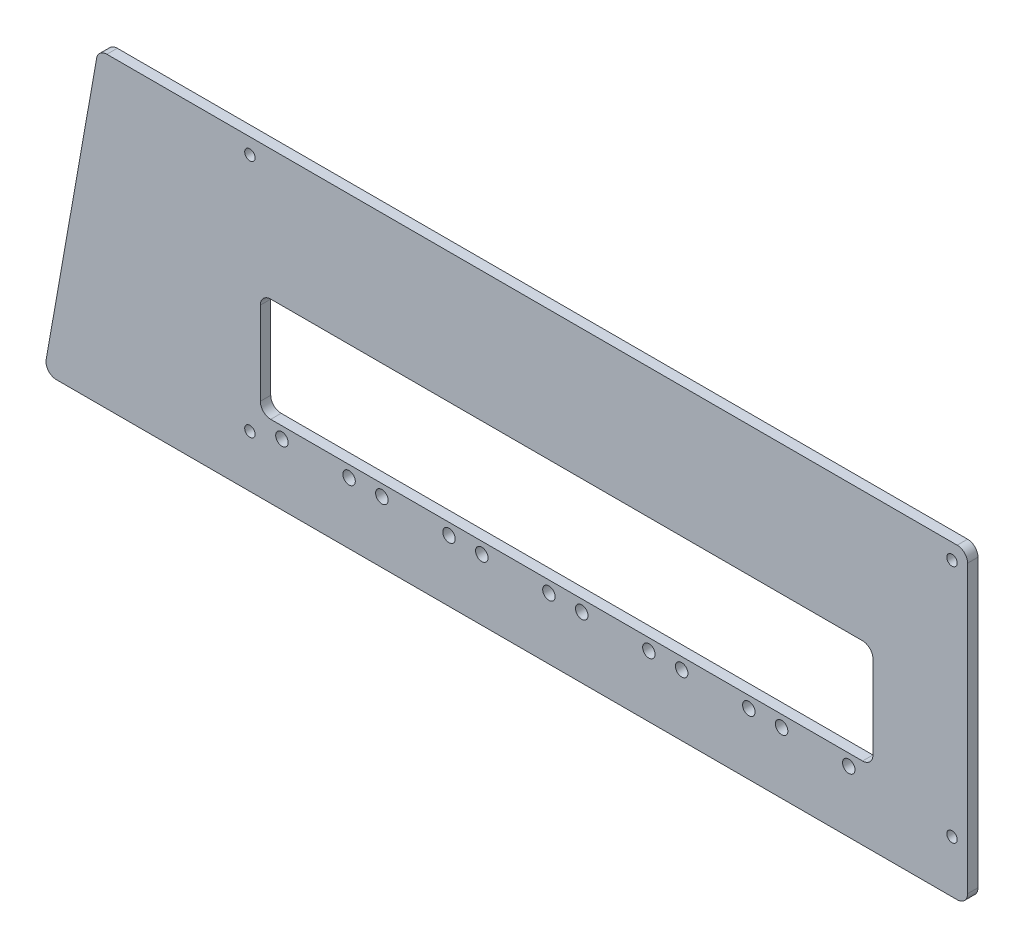
ISO-10303-21;
HEADER;
FILE_DESCRIPTION(('STEP AP214'),'2;1');
FILE_NAME('part.step','',(''),(''),'','','');
FILE_SCHEMA(('AUTOMOTIVE_DESIGN { 1 0 10303 214 1 1 1 1 }'));
ENDSEC;
DATA;
#1=APPLICATION_CONTEXT('core data for automotive mechanical design processes');
#2=APPLICATION_PROTOCOL_DEFINITION('international standard','automotive_design',2000,#1);
#3=PRODUCT_CONTEXT('',#1,'mechanical');
#4=PRODUCT('Part','Part','',(#3));
#5=PRODUCT_RELATED_PRODUCT_CATEGORY('part','',(#4));
#6=PRODUCT_DEFINITION_FORMATION('','',#4);
#7=PRODUCT_DEFINITION_CONTEXT('part definition',#1,'design');
#8=PRODUCT_DEFINITION('design','',#6,#7);
#9=PRODUCT_DEFINITION_SHAPE('','',#8);
#10=(LENGTH_UNIT() NAMED_UNIT(*) SI_UNIT(.MILLI.,.METRE.));
#11=(NAMED_UNIT(*) PLANE_ANGLE_UNIT() SI_UNIT($,.RADIAN.));
#12=(NAMED_UNIT(*) SI_UNIT($,.STERADIAN.) SOLID_ANGLE_UNIT());
#13=UNCERTAINTY_MEASURE_WITH_UNIT(LENGTH_MEASURE(1.E-05),#10,'distance_accuracy_value','');
#14=(GEOMETRIC_REPRESENTATION_CONTEXT(3) GLOBAL_UNCERTAINTY_ASSIGNED_CONTEXT((#13)) GLOBAL_UNIT_ASSIGNED_CONTEXT((#10,
#11,#12)) REPRESENTATION_CONTEXT('',''));
#15=CARTESIAN_POINT('',(0.,0.,0.));
#16=DIRECTION('',(0.,0.,1.));
#17=DIRECTION('',(1.,0.,0.));
#18=AXIS2_PLACEMENT_3D('',#15,#16,#17);
#19=CARTESIAN_POINT('',(127.96470119617,261.380138422726,10.));
#20=DIRECTION('',(0.,0.,-1.));
#21=DIRECTION('',(-1.,0.,0.));
#22=AXIS2_PLACEMENT_3D('',#19,#20,#21);
#23=PLANE('',#22);
#24=CARTESIAN_POINT('',(-40.6852988038306,35.3801384227226,10.));
#25=DIRECTION('',(0.,0.,1.));
#26=DIRECTION('',(1.,0.,0.));
#27=AXIS2_PLACEMENT_3D('',#24,#25,#26);
#28=CIRCLE('',#27,5.99999999999999);
#29=CARTESIAN_POINT('',(-34.6852988038307,35.3801384227226,10.));
#30=VERTEX_POINT('',#29);
#31=EDGE_CURVE('E398',#30,#30,#28,.T.);
#32=ORIENTED_EDGE('',*,*,#31,.F.);
#33=EDGE_LOOP('',(#32));
#34=FACE_BOUND('',#33,.T.);
#35=CARTESIAN_POINT('',(-136.685298803831,35.3801384227226,10.));
#36=DIRECTION('',(0.,0.,1.));
#37=DIRECTION('',(1.,0.,0.));
#38=AXIS2_PLACEMENT_3D('',#35,#36,#37);
#39=CIRCLE('',#38,5.99999999999999);
#40=CARTESIAN_POINT('',(-130.685298803831,35.3801384227226,10.));
#41=VERTEX_POINT('',#40);
#42=EDGE_CURVE('E408',#41,#41,#39,.T.);
#43=ORIENTED_EDGE('',*,*,#42,.F.);
#44=EDGE_LOOP('',(#43));
#45=FACE_BOUND('',#44,.T.);
#46=CARTESIAN_POINT('',(-520.68529880383,35.3801384227226,10.));
#47=DIRECTION('',(0.,0.,1.));
#48=DIRECTION('',(1.,0.,0.));
#49=AXIS2_PLACEMENT_3D('',#46,#47,#48);
#50=CIRCLE('',#49,5.99999999999999);
#51=CARTESIAN_POINT('',(-514.68529880383,35.3801384227226,10.));
#52=VERTEX_POINT('',#51);
#53=EDGE_CURVE('E418',#52,#52,#50,.T.);
#54=ORIENTED_EDGE('',*,*,#53,.F.);
#55=EDGE_LOOP('',(#54));
#56=FACE_BOUND('',#55,.T.);
#57=CARTESIAN_POINT('',(-168.18529880383,35.3801384227226,10.));
#58=DIRECTION('',(0.,0.,1.));
#59=DIRECTION('',(-1.,0.,0.));
#60=AXIS2_PLACEMENT_3D('',#57,#58,#59);
#61=CIRCLE('',#60,5.99999999999999);
#62=CARTESIAN_POINT('',(-174.18529880383,35.3801384227226,10.));
#63=VERTEX_POINT('',#62);
#64=EDGE_CURVE('E428',#63,#63,#61,.T.);
#65=ORIENTED_EDGE('',*,*,#64,.F.);
#66=EDGE_LOOP('',(#65));
#67=FACE_BOUND('',#66,.T.);
#68=CARTESIAN_POINT('',(-264.18529880383,35.3801384227226,10.));
#69=DIRECTION('',(0.,0.,1.));
#70=DIRECTION('',(-1.,0.,0.));
#71=AXIS2_PLACEMENT_3D('',#68,#69,#70);
#72=CIRCLE('',#71,5.99999999999999);
#73=CARTESIAN_POINT('',(-270.18529880383,35.3801384227226,10.));
#74=VERTEX_POINT('',#73);
#75=EDGE_CURVE('E438',#74,#74,#72,.T.);
#76=ORIENTED_EDGE('',*,*,#75,.F.);
#77=EDGE_LOOP('',(#76));
#78=FACE_BOUND('',#77,.T.);
#79=CARTESIAN_POINT('',(-360.18529880383,35.3801384227226,10.));
#80=DIRECTION('',(0.,0.,1.));
#81=DIRECTION('',(-1.,0.,0.));
#82=AXIS2_PLACEMENT_3D('',#79,#80,#81);
#83=CIRCLE('',#82,5.99999999999999);
#84=CARTESIAN_POINT('',(-366.18529880383,35.3801384227226,10.));
#85=VERTEX_POINT('',#84);
#86=EDGE_CURVE('E448',#85,#85,#83,.T.);
#87=ORIENTED_EDGE('',*,*,#86,.F.);
#88=EDGE_LOOP('',(#87));
#89=FACE_BOUND('',#88,.T.);
#90=CARTESIAN_POINT('',(-531.43529880383,56.3801384227226,10.));
#91=DIRECTION('',(0.,0.,1.));
#92=DIRECTION('',(1.,0.,0.));
#93=AXIS2_PLACEMENT_3D('',#90,#91,#92);
#94=CIRCLE('',#93,10.);
#95=CARTESIAN_POINT('',(-541.43529880383,56.3801384227226,10.));
#96=VERTEX_POINT('',#95);
#97=CARTESIAN_POINT('',(-531.43529880383,46.3801384227226,10.));
#98=VERTEX_POINT('',#97);
#99=EDGE_CURVE('E146',#96,#98,#94,.T.);
#100=ORIENTED_EDGE('',*,*,#99,.F.);
#101=DIRECTION('',(0.,-1.,0.));
#102=VECTOR('',#101,1.);
#103=CARTESIAN_POINT('',(-541.43529880383,56.3801384227226,10.));
#104=LINE('',#103,#102);
#105=CARTESIAN_POINT('',(-541.43529880383,136.380138422722,10.));
#106=VERTEX_POINT('',#105);
#107=EDGE_CURVE('E181',#106,#96,#104,.T.);
#108=ORIENTED_EDGE('',*,*,#107,.F.);
#109=CARTESIAN_POINT('',(-531.43529880383,136.380138422723,10.));
#110=DIRECTION('',(0.,0.,1.));
#111=DIRECTION('',(1.,0.,0.));
#112=AXIS2_PLACEMENT_3D('',#109,#110,#111);
#113=CIRCLE('',#112,10.);
#114=CARTESIAN_POINT('',(-531.43529880383,146.380138422723,10.));
#115=VERTEX_POINT('',#114);
#116=EDGE_CURVE('E179',#115,#106,#113,.T.);
#117=ORIENTED_EDGE('',*,*,#116,.F.);
#118=DIRECTION('',(-1.,0.,0.));
#119=VECTOR('',#118,1.);
#120=CARTESIAN_POINT('',(-531.43529880383,146.380138422723,10.));
#121=LINE('',#120,#119);
#122=CARTESIAN_POINT('',(37.064561069066,146.380138422723,10.));
#123=VERTEX_POINT('',#122);
#124=EDGE_CURVE('E177',#123,#115,#121,.T.);
#125=ORIENTED_EDGE('',*,*,#124,.F.);
#126=CARTESIAN_POINT('',(37.0645610690661,136.380138422723,10.));
#127=DIRECTION('',(0.,0.,1.));
#128=DIRECTION('',(1.,0.,0.));
#129=AXIS2_PLACEMENT_3D('',#126,#127,#128);
#130=CIRCLE('',#129,10.);
#131=CARTESIAN_POINT('',(47.0645610690661,136.380138422722,10.));
#132=VERTEX_POINT('',#131);
#133=EDGE_CURVE('E175',#132,#123,#130,.T.);
#134=ORIENTED_EDGE('',*,*,#133,.F.);
#135=DIRECTION('',(0.,1.,0.));
#136=VECTOR('',#135,1.);
#137=CARTESIAN_POINT('',(47.0645610690661,136.380138422722,10.));
#138=LINE('',#137,#136);
#139=CARTESIAN_POINT('',(47.0645610690661,56.3801384227226,10.));
#140=VERTEX_POINT('',#139);
#141=EDGE_CURVE('E170',#140,#132,#138,.T.);
#142=ORIENTED_EDGE('',*,*,#141,.F.);
#143=CARTESIAN_POINT('',(37.0645610690661,56.3801384227225,10.));
#144=DIRECTION('',(0.,0.,1.));
#145=DIRECTION('',(1.,0.,0.));
#146=AXIS2_PLACEMENT_3D('',#143,#144,#145);
#147=CIRCLE('',#146,10.);
#148=CARTESIAN_POINT('',(37.064561069066,46.3801384227225,10.));
#149=VERTEX_POINT('',#148);
#150=EDGE_CURVE('E168',#149,#140,#147,.T.);
#151=ORIENTED_EDGE('',*,*,#150,.F.);
#152=DIRECTION('',(1.,0.,0.));
#153=VECTOR('',#152,1.);
#154=CARTESIAN_POINT('',(-531.43529880383,46.3801384227226,10.));
#155=LINE('',#154,#153);
#156=EDGE_CURVE('E154',#98,#149,#155,.T.);
#157=ORIENTED_EDGE('',*,*,#156,.F.);
#158=EDGE_LOOP('',(#100,#108,#117,#125,#134,#142,#151,#157));
#159=FACE_BOUND('',#158,.T.);
#160=CARTESIAN_POINT('',(122.96470119617,256.380138422726,10.));
#161=DIRECTION('',(0.,0.,1.));
#162=DIRECTION('',(-1.,0.,0.));
#163=AXIS2_PLACEMENT_3D('',#160,#161,#162);
#164=CIRCLE('',#163,5.00000000000006);
#165=CARTESIAN_POINT('',(117.96470119617,256.380138422726,10.));
#166=VERTEX_POINT('',#165);
#167=EDGE_CURVE('E220',#166,#166,#164,.T.);
#168=ORIENTED_EDGE('',*,*,#167,.F.);
#169=EDGE_LOOP('',(#168));
#170=FACE_BOUND('',#169,.T.);
#171=CARTESIAN_POINT('',(127.96470119617,261.380138422726,10.));
#172=DIRECTION('',(0.,0.,1.));
#173=DIRECTION('',(-1.,0.,0.));
#174=AXIS2_PLACEMENT_3D('',#171,#172,#173);
#175=CIRCLE('',#174,10.);
#176=CARTESIAN_POINT('',(137.96470119617,261.380138422726,10.));
#177=VERTEX_POINT('',#176);
#178=CARTESIAN_POINT('',(127.96470119617,271.380138422726,10.));
#179=VERTEX_POINT('',#178);
#180=EDGE_CURVE('E232',#177,#179,#175,.T.);
#181=ORIENTED_EDGE('',*,*,#180,.T.);
#182=DIRECTION('',(-1.,0.,0.));
#183=VECTOR('',#182,1.);
#184=CARTESIAN_POINT('',(127.96470119617,271.380138422726,10.));
#185=LINE('',#184,#183);
#186=CARTESIAN_POINT('',(-688.827843183062,271.380138422723,10.));
#187=VERTEX_POINT('',#186);
#188=EDGE_CURVE('E235',#179,#187,#185,.T.);
#189=ORIENTED_EDGE('',*,*,#188,.T.);
#190=CARTESIAN_POINT('',(-688.827843183062,261.380138422723,10.));
#191=DIRECTION('',(0.,0.,1.));
#192=DIRECTION('',(1.,0.,0.));
#193=AXIS2_PLACEMENT_3D('',#190,#191,#192);
#194=CIRCLE('',#193,9.99999999999999);
#195=CARTESIAN_POINT('',(-698.675920713184,263.116620199392,10.));
#196=VERTEX_POINT('',#195);
#197=EDGE_CURVE('E238',#187,#196,#194,.T.);
#198=ORIENTED_EDGE('',*,*,#197,.T.);
#199=DIRECTION('',(-0.173648177666925,-0.984807753012209,0.));
#200=VECTOR('',#199,1.);
#201=CARTESIAN_POINT('',(-747.16584040801,-11.8833798006081,10.));
#202=LINE('',#201,#200);
#203=CARTESIAN_POINT('',(-747.16584040801,-11.8833798006081,10.));
#204=VERTEX_POINT('',#203);
#205=EDGE_CURVE('E240',#196,#204,#202,.T.);
#206=ORIENTED_EDGE('',*,*,#205,.T.);
#207=CARTESIAN_POINT('',(-737.317762877888,-13.6198615772775,10.));
#208=DIRECTION('',(0.,0.,1.));
#209=DIRECTION('',(-1.,0.,0.));
#210=AXIS2_PLACEMENT_3D('',#207,#208,#209);
#211=CIRCLE('',#210,10.);
#212=CARTESIAN_POINT('',(-737.317762877888,-23.6198615772775,10.));
#213=VERTEX_POINT('',#212);
#214=EDGE_CURVE('E242',#204,#213,#211,.T.);
#215=ORIENTED_EDGE('',*,*,#214,.T.);
#216=DIRECTION('',(1.,0.,0.));
#217=VECTOR('',#216,1.);
#218=CARTESIAN_POINT('',(-737.317762877888,-23.6198615772775,10.));
#219=LINE('',#218,#217);
#220=CARTESIAN_POINT('',(127.96470119617,-23.6198615772743,10.));
#221=VERTEX_POINT('',#220);
#222=EDGE_CURVE('E244',#213,#221,#219,.T.);
#223=ORIENTED_EDGE('',*,*,#222,.T.);
#224=CARTESIAN_POINT('',(127.96470119617,-13.6198615772743,10.));
#225=DIRECTION('',(0.,0.,1.));
#226=DIRECTION('',(1.,0.,0.));
#227=AXIS2_PLACEMENT_3D('',#224,#225,#226);
#228=CIRCLE('',#227,10.);
#229=CARTESIAN_POINT('',(137.96470119617,-13.6198615772743,10.));
#230=VERTEX_POINT('',#229);
#231=EDGE_CURVE('E246',#221,#230,#228,.T.);
#232=ORIENTED_EDGE('',*,*,#231,.T.);
#233=DIRECTION('',(0.,1.,0.));
#234=VECTOR('',#233,1.);
#235=CARTESIAN_POINT('',(137.96470119617,261.380138422726,10.));
#236=LINE('',#235,#234);
#237=EDGE_CURVE('E248',#230,#177,#236,.T.);
#238=ORIENTED_EDGE('',*,*,#237,.T.);
#239=EDGE_LOOP('',(#181,#189,#198,#206,#215,#223,#232,#238));
#240=FACE_BOUND('',#239,.T.);
#241=CARTESIAN_POINT('',(-551.43529880383,256.380138422723,10.));
#242=DIRECTION('',(0.,0.,1.));
#243=DIRECTION('',(1.,0.,0.));
#244=AXIS2_PLACEMENT_3D('',#241,#242,#243);
#245=CIRCLE('',#244,5.00000000000005);
#246=CARTESIAN_POINT('',(-546.43529880383,256.380138422723,10.));
#247=VERTEX_POINT('',#246);
#248=EDGE_CURVE('E226',#247,#247,#245,.T.);
#249=ORIENTED_EDGE('',*,*,#248,.F.);
#250=EDGE_LOOP('',(#249));
#251=FACE_BOUND('',#250,.T.);
#252=CARTESIAN_POINT('',(122.96470119617,26.3801384227257,10.));
#253=DIRECTION('',(0.,0.,1.));
#254=DIRECTION('',(-1.,0.,0.));
#255=AXIS2_PLACEMENT_3D('',#252,#253,#254);
#256=CIRCLE('',#255,5.00000000000004);
#257=CARTESIAN_POINT('',(117.96470119617,26.3801384227257,10.));
#258=VERTEX_POINT('',#257);
#259=EDGE_CURVE('E214',#258,#258,#256,.T.);
#260=ORIENTED_EDGE('',*,*,#259,.F.);
#261=EDGE_LOOP('',(#260));
#262=FACE_BOUND('',#261,.T.);
#263=CARTESIAN_POINT('',(-424.68529880383,35.3801384227226,10.));
#264=DIRECTION('',(0.,0.,1.));
#265=DIRECTION('',(1.,0.,0.));
#266=AXIS2_PLACEMENT_3D('',#263,#264,#265);
#267=CIRCLE('',#266,5.99999999999999);
#268=CARTESIAN_POINT('',(-418.68529880383,35.3801384227226,10.));
#269=VERTEX_POINT('',#268);
#270=EDGE_CURVE('E184',#269,#269,#267,.T.);
#271=ORIENTED_EDGE('',*,*,#270,.F.);
#272=EDGE_LOOP('',(#271));
#273=FACE_BOUND('',#272,.T.);
#274=CARTESIAN_POINT('',(-328.68529880383,35.3801384227226,10.));
#275=DIRECTION('',(0.,0.,1.));
#276=DIRECTION('',(1.,0.,0.));
#277=AXIS2_PLACEMENT_3D('',#274,#275,#276);
#278=CIRCLE('',#277,5.99999999999999);
#279=CARTESIAN_POINT('',(-322.68529880383,35.3801384227226,10.));
#280=VERTEX_POINT('',#279);
#281=EDGE_CURVE('E443',#280,#280,#278,.T.);
#282=ORIENTED_EDGE('',*,*,#281,.F.);
#283=EDGE_LOOP('',(#282));
#284=FACE_BOUND('',#283,.T.);
#285=CARTESIAN_POINT('',(-232.68529880383,35.3801384227226,10.));
#286=DIRECTION('',(0.,0.,1.));
#287=DIRECTION('',(1.,0.,0.));
#288=AXIS2_PLACEMENT_3D('',#285,#286,#287);
#289=CIRCLE('',#288,5.99999999999999);
#290=CARTESIAN_POINT('',(-226.68529880383,35.3801384227226,10.));
#291=VERTEX_POINT('',#290);
#292=EDGE_CURVE('E433',#291,#291,#289,.T.);
#293=ORIENTED_EDGE('',*,*,#292,.F.);
#294=EDGE_LOOP('',(#293));
#295=FACE_BOUND('',#294,.T.);
#296=CARTESIAN_POINT('',(-551.43529880383,26.3801384227226,10.));
#297=DIRECTION('',(0.,0.,1.));
#298=DIRECTION('',(1.,0.,0.));
#299=AXIS2_PLACEMENT_3D('',#296,#297,#298);
#300=CIRCLE('',#299,5.00000000000004);
#301=CARTESIAN_POINT('',(-546.43529880383,26.3801384227226,10.));
#302=VERTEX_POINT('',#301);
#303=EDGE_CURVE('E423',#302,#302,#300,.T.);
#304=ORIENTED_EDGE('',*,*,#303,.F.);
#305=EDGE_LOOP('',(#304));
#306=FACE_BOUND('',#305,.T.);
#307=CARTESIAN_POINT('',(-456.18529880383,35.3801384227226,10.));
#308=DIRECTION('',(0.,0.,1.));
#309=DIRECTION('',(-1.,0.,0.));
#310=AXIS2_PLACEMENT_3D('',#307,#308,#309);
#311=CIRCLE('',#310,5.99999999999999);
#312=CARTESIAN_POINT('',(-462.18529880383,35.3801384227226,10.));
#313=VERTEX_POINT('',#312);
#314=EDGE_CURVE('E413',#313,#313,#311,.T.);
#315=ORIENTED_EDGE('',*,*,#314,.F.);
#316=EDGE_LOOP('',(#315));
#317=FACE_BOUND('',#316,.T.);
#318=CARTESIAN_POINT('',(-72.1852988038305,35.3801384227226,10.));
#319=DIRECTION('',(0.,0.,1.));
#320=DIRECTION('',(-1.,0.,0.));
#321=AXIS2_PLACEMENT_3D('',#318,#319,#320);
#322=CIRCLE('',#321,5.99999999999999);
#323=CARTESIAN_POINT('',(-78.1852988038305,35.3801384227226,10.));
#324=VERTEX_POINT('',#323);
#325=EDGE_CURVE('E403',#324,#324,#322,.T.);
#326=ORIENTED_EDGE('',*,*,#325,.F.);
#327=EDGE_LOOP('',(#326));
#328=FACE_BOUND('',#327,.T.);
#329=CARTESIAN_POINT('',(23.8147011961694,35.3801384227226,10.));
#330=DIRECTION('',(0.,0.,1.));
#331=DIRECTION('',(-1.,0.,0.));
#332=AXIS2_PLACEMENT_3D('',#329,#330,#331);
#333=CIRCLE('',#332,5.99999999999999);
#334=CARTESIAN_POINT('',(17.8147011961694,35.3801384227226,10.));
#335=VERTEX_POINT('',#334);
#336=EDGE_CURVE('E392',#335,#335,#333,.T.);
#337=ORIENTED_EDGE('',*,*,#336,.F.);
#338=EDGE_LOOP('',(#337));
#339=FACE_BOUND('',#338,.T.);
#340=ADVANCED_FACE('F33',(#34,#45,#56,#67,#78,#89,#159,#170,#240,#251,#262,#273,#284,#295,#306,
#317,#328,#339),#23,.F.);
#341=CARTESIAN_POINT('',(127.96470119617,261.380138422726,0.));
#342=DIRECTION('',(0.,0.,-1.));
#343=DIRECTION('',(-1.,0.,0.));
#344=AXIS2_PLACEMENT_3D('',#341,#342,#343);
#345=PLANE('',#344);
#346=CARTESIAN_POINT('',(-40.6852988038306,35.3801384227226,0.));
#347=DIRECTION('',(0.,0.,1.));
#348=DIRECTION('',(1.,0.,0.));
#349=AXIS2_PLACEMENT_3D('',#346,#347,#348);
#350=CIRCLE('',#349,5.99999999999999);
#351=CARTESIAN_POINT('',(-34.6852988038307,35.3801384227226,0.));
#352=VERTEX_POINT('',#351);
#353=EDGE_CURVE('E395',#352,#352,#350,.T.);
#354=ORIENTED_EDGE('',*,*,#353,.T.);
#355=EDGE_LOOP('',(#354));
#356=FACE_BOUND('',#355,.T.);
#357=CARTESIAN_POINT('',(-136.685298803831,35.3801384227226,0.));
#358=DIRECTION('',(0.,0.,1.));
#359=DIRECTION('',(1.,0.,0.));
#360=AXIS2_PLACEMENT_3D('',#357,#358,#359);
#361=CIRCLE('',#360,5.99999999999999);
#362=CARTESIAN_POINT('',(-130.685298803831,35.3801384227226,0.));
#363=VERTEX_POINT('',#362);
#364=EDGE_CURVE('E406',#363,#363,#361,.T.);
#365=ORIENTED_EDGE('',*,*,#364,.T.);
#366=EDGE_LOOP('',(#365));
#367=FACE_BOUND('',#366,.T.);
#368=CARTESIAN_POINT('',(-520.68529880383,35.3801384227226,0.));
#369=DIRECTION('',(0.,0.,1.));
#370=DIRECTION('',(1.,0.,0.));
#371=AXIS2_PLACEMENT_3D('',#368,#369,#370);
#372=CIRCLE('',#371,5.99999999999999);
#373=CARTESIAN_POINT('',(-514.68529880383,35.3801384227226,0.));
#374=VERTEX_POINT('',#373);
#375=EDGE_CURVE('E416',#374,#374,#372,.T.);
#376=ORIENTED_EDGE('',*,*,#375,.T.);
#377=EDGE_LOOP('',(#376));
#378=FACE_BOUND('',#377,.T.);
#379=CARTESIAN_POINT('',(-168.18529880383,35.3801384227226,0.));
#380=DIRECTION('',(0.,0.,1.));
#381=DIRECTION('',(-1.,0.,0.));
#382=AXIS2_PLACEMENT_3D('',#379,#380,#381);
#383=CIRCLE('',#382,5.99999999999999);
#384=CARTESIAN_POINT('',(-174.18529880383,35.3801384227226,0.));
#385=VERTEX_POINT('',#384);
#386=EDGE_CURVE('E426',#385,#385,#383,.T.);
#387=ORIENTED_EDGE('',*,*,#386,.T.);
#388=EDGE_LOOP('',(#387));
#389=FACE_BOUND('',#388,.T.);
#390=CARTESIAN_POINT('',(-264.18529880383,35.3801384227226,0.));
#391=DIRECTION('',(0.,0.,1.));
#392=DIRECTION('',(-1.,0.,0.));
#393=AXIS2_PLACEMENT_3D('',#390,#391,#392);
#394=CIRCLE('',#393,5.99999999999999);
#395=CARTESIAN_POINT('',(-270.18529880383,35.3801384227226,0.));
#396=VERTEX_POINT('',#395);
#397=EDGE_CURVE('E436',#396,#396,#394,.T.);
#398=ORIENTED_EDGE('',*,*,#397,.T.);
#399=EDGE_LOOP('',(#398));
#400=FACE_BOUND('',#399,.T.);
#401=CARTESIAN_POINT('',(-360.18529880383,35.3801384227226,0.));
#402=DIRECTION('',(0.,0.,1.));
#403=DIRECTION('',(-1.,0.,0.));
#404=AXIS2_PLACEMENT_3D('',#401,#402,#403);
#405=CIRCLE('',#404,5.99999999999999);
#406=CARTESIAN_POINT('',(-366.18529880383,35.3801384227226,0.));
#407=VERTEX_POINT('',#406);
#408=EDGE_CURVE('E446',#407,#407,#405,.T.);
#409=ORIENTED_EDGE('',*,*,#408,.T.);
#410=EDGE_LOOP('',(#409));
#411=FACE_BOUND('',#410,.T.);
#412=DIRECTION('',(0.,-1.,0.));
#413=VECTOR('',#412,1.);
#414=CARTESIAN_POINT('',(-541.43529880383,56.3801384227226,0.));
#415=LINE('',#414,#413);
#416=CARTESIAN_POINT('',(-541.43529880383,136.380138422722,0.));
#417=VERTEX_POINT('',#416);
#418=CARTESIAN_POINT('',(-541.43529880383,56.3801384227226,0.));
#419=VERTEX_POINT('',#418);
#420=EDGE_CURVE('E155',#417,#419,#415,.T.);
#421=ORIENTED_EDGE('',*,*,#420,.T.);
#422=CARTESIAN_POINT('',(-531.43529880383,56.3801384227226,0.));
#423=DIRECTION('',(0.,0.,1.));
#424=DIRECTION('',(1.,0.,0.));
#425=AXIS2_PLACEMENT_3D('',#422,#423,#424);
#426=CIRCLE('',#425,10.);
#427=CARTESIAN_POINT('',(-531.43529880383,46.3801384227226,0.));
#428=VERTEX_POINT('',#427);
#429=EDGE_CURVE('E56',#419,#428,#426,.T.);
#430=ORIENTED_EDGE('',*,*,#429,.T.);
#431=DIRECTION('',(1.,0.,0.));
#432=VECTOR('',#431,1.);
#433=CARTESIAN_POINT('',(-531.43529880383,46.3801384227226,0.));
#434=LINE('',#433,#432);
#435=CARTESIAN_POINT('',(37.064561069066,46.3801384227225,0.));
#436=VERTEX_POINT('',#435);
#437=EDGE_CURVE('E161',#428,#436,#434,.T.);
#438=ORIENTED_EDGE('',*,*,#437,.T.);
#439=CARTESIAN_POINT('',(37.0645610690661,56.3801384227225,0.));
#440=DIRECTION('',(0.,0.,1.));
#441=DIRECTION('',(1.,0.,0.));
#442=AXIS2_PLACEMENT_3D('',#439,#440,#441);
#443=CIRCLE('',#442,10.);
#444=CARTESIAN_POINT('',(47.0645610690661,56.3801384227226,0.));
#445=VERTEX_POINT('',#444);
#446=EDGE_CURVE('E186',#436,#445,#443,.T.);
#447=ORIENTED_EDGE('',*,*,#446,.T.);
#448=DIRECTION('',(0.,1.,0.));
#449=VECTOR('',#448,1.);
#450=CARTESIAN_POINT('',(47.0645610690661,136.380138422722,0.));
#451=LINE('',#450,#449);
#452=CARTESIAN_POINT('',(47.0645610690661,136.380138422722,0.));
#453=VERTEX_POINT('',#452);
#454=EDGE_CURVE('E189',#445,#453,#451,.T.);
#455=ORIENTED_EDGE('',*,*,#454,.T.);
#456=CARTESIAN_POINT('',(37.0645610690661,136.380138422723,0.));
#457=DIRECTION('',(0.,0.,1.));
#458=DIRECTION('',(1.,0.,0.));
#459=AXIS2_PLACEMENT_3D('',#456,#457,#458);
#460=CIRCLE('',#459,10.);
#461=CARTESIAN_POINT('',(37.064561069066,146.380138422723,0.));
#462=VERTEX_POINT('',#461);
#463=EDGE_CURVE('E192',#453,#462,#460,.T.);
#464=ORIENTED_EDGE('',*,*,#463,.T.);
#465=DIRECTION('',(-1.,0.,0.));
#466=VECTOR('',#465,1.);
#467=CARTESIAN_POINT('',(-531.43529880383,146.380138422723,0.));
#468=LINE('',#467,#466);
#469=CARTESIAN_POINT('',(-531.43529880383,146.380138422723,0.));
#470=VERTEX_POINT('',#469);
#471=EDGE_CURVE('E195',#462,#470,#468,.T.);
#472=ORIENTED_EDGE('',*,*,#471,.T.);
#473=CARTESIAN_POINT('',(-531.43529880383,136.380138422723,0.));
#474=DIRECTION('',(0.,0.,1.));
#475=DIRECTION('',(1.,0.,0.));
#476=AXIS2_PLACEMENT_3D('',#473,#474,#475);
#477=CIRCLE('',#476,10.);
#478=EDGE_CURVE('E198',#470,#417,#477,.T.);
#479=ORIENTED_EDGE('',*,*,#478,.T.);
#480=EDGE_LOOP('',(#421,#430,#438,#447,#455,#464,#472,#479));
#481=FACE_BOUND('',#480,.T.);
#482=CARTESIAN_POINT('',(122.96470119617,256.380138422726,0.));
#483=DIRECTION('',(0.,0.,1.));
#484=DIRECTION('',(-1.,0.,0.));
#485=AXIS2_PLACEMENT_3D('',#482,#483,#484);
#486=CIRCLE('',#485,5.00000000000006);
#487=CARTESIAN_POINT('',(117.96470119617,256.380138422726,0.));
#488=VERTEX_POINT('',#487);
#489=EDGE_CURVE('E217',#488,#488,#486,.T.);
#490=ORIENTED_EDGE('',*,*,#489,.T.);
#491=EDGE_LOOP('',(#490));
#492=FACE_BOUND('',#491,.T.);
#493=CARTESIAN_POINT('',(127.96470119617,261.380138422726,0.));
#494=DIRECTION('',(0.,0.,1.));
#495=DIRECTION('',(-1.,0.,0.));
#496=AXIS2_PLACEMENT_3D('',#493,#494,#495);
#497=CIRCLE('',#496,10.);
#498=CARTESIAN_POINT('',(137.96470119617,261.380138422726,0.));
#499=VERTEX_POINT('',#498);
#500=CARTESIAN_POINT('',(127.96470119617,271.380138422726,0.));
#501=VERTEX_POINT('',#500);
#502=EDGE_CURVE('E229',#499,#501,#497,.T.);
#503=ORIENTED_EDGE('',*,*,#502,.F.);
#504=DIRECTION('',(0.,1.,0.));
#505=VECTOR('',#504,1.);
#506=CARTESIAN_POINT('',(137.96470119617,261.380138422726,0.));
#507=LINE('',#506,#505);
#508=CARTESIAN_POINT('',(137.96470119617,-13.6198615772743,0.));
#509=VERTEX_POINT('',#508);
#510=EDGE_CURVE('E236',#509,#499,#507,.T.);
#511=ORIENTED_EDGE('',*,*,#510,.F.);
#512=CARTESIAN_POINT('',(127.96470119617,-13.6198615772743,0.));
#513=DIRECTION('',(0.,0.,1.));
#514=DIRECTION('',(1.,0.,0.));
#515=AXIS2_PLACEMENT_3D('',#512,#513,#514);
#516=CIRCLE('',#515,10.);
#517=CARTESIAN_POINT('',(127.96470119617,-23.6198615772743,0.));
#518=VERTEX_POINT('',#517);
#519=EDGE_CURVE('E263',#518,#509,#516,.T.);
#520=ORIENTED_EDGE('',*,*,#519,.F.);
#521=DIRECTION('',(1.,0.,0.));
#522=VECTOR('',#521,1.);
#523=CARTESIAN_POINT('',(-737.317762877888,-23.6198615772775,0.));
#524=LINE('',#523,#522);
#525=CARTESIAN_POINT('',(-737.317762877888,-23.6198615772775,0.));
#526=VERTEX_POINT('',#525);
#527=EDGE_CURVE('E261',#526,#518,#524,.T.);
#528=ORIENTED_EDGE('',*,*,#527,.F.);
#529=CARTESIAN_POINT('',(-737.317762877888,-13.6198615772775,0.));
#530=DIRECTION('',(0.,0.,1.));
#531=DIRECTION('',(-1.,0.,0.));
#532=AXIS2_PLACEMENT_3D('',#529,#530,#531);
#533=CIRCLE('',#532,10.);
#534=CARTESIAN_POINT('',(-747.16584040801,-11.8833798006081,0.));
#535=VERTEX_POINT('',#534);
#536=EDGE_CURVE('E259',#535,#526,#533,.T.);
#537=ORIENTED_EDGE('',*,*,#536,.F.);
#538=DIRECTION('',(-0.173648177666925,-0.984807753012209,0.));
#539=VECTOR('',#538,1.);
#540=CARTESIAN_POINT('',(-747.16584040801,-11.8833798006081,0.));
#541=LINE('',#540,#539);
#542=CARTESIAN_POINT('',(-698.675920713184,263.116620199392,0.));
#543=VERTEX_POINT('',#542);
#544=EDGE_CURVE('E257',#543,#535,#541,.T.);
#545=ORIENTED_EDGE('',*,*,#544,.F.);
#546=CARTESIAN_POINT('',(-688.827843183062,261.380138422723,0.));
#547=DIRECTION('',(0.,0.,1.));
#548=DIRECTION('',(1.,0.,0.));
#549=AXIS2_PLACEMENT_3D('',#546,#547,#548);
#550=CIRCLE('',#549,9.99999999999999);
#551=CARTESIAN_POINT('',(-688.827843183062,271.380138422723,0.));
#552=VERTEX_POINT('',#551);
#553=EDGE_CURVE('E255',#552,#543,#550,.T.);
#554=ORIENTED_EDGE('',*,*,#553,.F.);
#555=DIRECTION('',(-1.,0.,0.));
#556=VECTOR('',#555,1.);
#557=CARTESIAN_POINT('',(127.96470119617,271.380138422726,0.));
#558=LINE('',#557,#556);
#559=EDGE_CURVE('E253',#501,#552,#558,.T.);
#560=ORIENTED_EDGE('',*,*,#559,.F.);
#561=EDGE_LOOP('',(#503,#511,#520,#528,#537,#545,#554,#560));
#562=FACE_BOUND('',#561,.T.);
#563=CARTESIAN_POINT('',(-551.43529880383,256.380138422723,0.));
#564=DIRECTION('',(0.,0.,1.));
#565=DIRECTION('',(1.,0.,0.));
#566=AXIS2_PLACEMENT_3D('',#563,#564,#565);
#567=CIRCLE('',#566,5.00000000000005);
#568=CARTESIAN_POINT('',(-546.43529880383,256.380138422723,0.));
#569=VERTEX_POINT('',#568);
#570=EDGE_CURVE('E223',#569,#569,#567,.T.);
#571=ORIENTED_EDGE('',*,*,#570,.T.);
#572=EDGE_LOOP('',(#571));
#573=FACE_BOUND('',#572,.T.);
#574=CARTESIAN_POINT('',(122.96470119617,26.3801384227257,0.));
#575=DIRECTION('',(0.,0.,1.));
#576=DIRECTION('',(-1.,0.,0.));
#577=AXIS2_PLACEMENT_3D('',#574,#575,#576);
#578=CIRCLE('',#577,5.00000000000004);
#579=CARTESIAN_POINT('',(117.96470119617,26.3801384227257,0.));
#580=VERTEX_POINT('',#579);
#581=EDGE_CURVE('E162',#580,#580,#578,.T.);
#582=ORIENTED_EDGE('',*,*,#581,.T.);
#583=EDGE_LOOP('',(#582));
#584=FACE_BOUND('',#583,.T.);
#585=CARTESIAN_POINT('',(-424.68529880383,35.3801384227226,0.));
#586=DIRECTION('',(0.,0.,1.));
#587=DIRECTION('',(1.,0.,0.));
#588=AXIS2_PLACEMENT_3D('',#585,#586,#587);
#589=CIRCLE('',#588,5.99999999999999);
#590=CARTESIAN_POINT('',(-418.68529880383,35.3801384227226,0.));
#591=VERTEX_POINT('',#590);
#592=EDGE_CURVE('E367',#591,#591,#589,.T.);
#593=ORIENTED_EDGE('',*,*,#592,.T.);
#594=EDGE_LOOP('',(#593));
#595=FACE_BOUND('',#594,.T.);
#596=CARTESIAN_POINT('',(-328.68529880383,35.3801384227226,0.));
#597=DIRECTION('',(0.,0.,1.));
#598=DIRECTION('',(1.,0.,0.));
#599=AXIS2_PLACEMENT_3D('',#596,#597,#598);
#600=CIRCLE('',#599,5.99999999999999);
#601=CARTESIAN_POINT('',(-322.68529880383,35.3801384227226,0.));
#602=VERTEX_POINT('',#601);
#603=EDGE_CURVE('E371',#602,#602,#600,.T.);
#604=ORIENTED_EDGE('',*,*,#603,.T.);
#605=EDGE_LOOP('',(#604));
#606=FACE_BOUND('',#605,.T.);
#607=CARTESIAN_POINT('',(-232.68529880383,35.3801384227226,0.));
#608=DIRECTION('',(0.,0.,1.));
#609=DIRECTION('',(1.,0.,0.));
#610=AXIS2_PLACEMENT_3D('',#607,#608,#609);
#611=CIRCLE('',#610,5.99999999999999);
#612=CARTESIAN_POINT('',(-226.68529880383,35.3801384227226,0.));
#613=VERTEX_POINT('',#612);
#614=EDGE_CURVE('E375',#613,#613,#611,.T.);
#615=ORIENTED_EDGE('',*,*,#614,.T.);
#616=EDGE_LOOP('',(#615));
#617=FACE_BOUND('',#616,.T.);
#618=CARTESIAN_POINT('',(-551.43529880383,26.3801384227226,0.));
#619=DIRECTION('',(0.,0.,1.));
#620=DIRECTION('',(1.,0.,0.));
#621=AXIS2_PLACEMENT_3D('',#618,#619,#620);
#622=CIRCLE('',#621,5.00000000000004);
#623=CARTESIAN_POINT('',(-546.43529880383,26.3801384227226,0.));
#624=VERTEX_POINT('',#623);
#625=EDGE_CURVE('E379',#624,#624,#622,.T.);
#626=ORIENTED_EDGE('',*,*,#625,.T.);
#627=EDGE_LOOP('',(#626));
#628=FACE_BOUND('',#627,.T.);
#629=CARTESIAN_POINT('',(-456.18529880383,35.3801384227226,0.));
#630=DIRECTION('',(0.,0.,1.));
#631=DIRECTION('',(-1.,0.,0.));
#632=AXIS2_PLACEMENT_3D('',#629,#630,#631);
#633=CIRCLE('',#632,5.99999999999999);
#634=CARTESIAN_POINT('',(-462.18529880383,35.3801384227226,0.));
#635=VERTEX_POINT('',#634);
#636=EDGE_CURVE('E383',#635,#635,#633,.T.);
#637=ORIENTED_EDGE('',*,*,#636,.T.);
#638=EDGE_LOOP('',(#637));
#639=FACE_BOUND('',#638,.T.);
#640=CARTESIAN_POINT('',(-72.1852988038305,35.3801384227226,0.));
#641=DIRECTION('',(0.,0.,1.));
#642=DIRECTION('',(-1.,0.,0.));
#643=AXIS2_PLACEMENT_3D('',#640,#641,#642);
#644=CIRCLE('',#643,5.99999999999999);
#645=CARTESIAN_POINT('',(-78.1852988038305,35.3801384227226,0.));
#646=VERTEX_POINT('',#645);
#647=EDGE_CURVE('E387',#646,#646,#644,.T.);
#648=ORIENTED_EDGE('',*,*,#647,.T.);
#649=EDGE_LOOP('',(#648));
#650=FACE_BOUND('',#649,.T.);
#651=CARTESIAN_POINT('',(23.8147011961694,35.3801384227226,0.));
#652=DIRECTION('',(0.,0.,1.));
#653=DIRECTION('',(-1.,0.,0.));
#654=AXIS2_PLACEMENT_3D('',#651,#652,#653);
#655=CIRCLE('',#654,5.99999999999999);
#656=CARTESIAN_POINT('',(17.8147011961694,35.3801384227226,0.));
#657=VERTEX_POINT('',#656);
#658=EDGE_CURVE('E390',#657,#657,#655,.T.);
#659=ORIENTED_EDGE('',*,*,#658,.T.);
#660=EDGE_LOOP('',(#659));
#661=FACE_BOUND('',#660,.T.);
#662=ADVANCED_FACE('F293',(#356,#367,#378,#389,#400,#411,#481,#492,#562,#573,#584,#595,#606,
#617,#628,#639,#650,#661),#345,.T.);
#663=CARTESIAN_POINT('',(127.96470119617,261.380138422726,10.));
#664=DIRECTION('',(0.,0.,-1.));
#665=DIRECTION('',(-1.,0.,0.));
#666=AXIS2_PLACEMENT_3D('',#663,#664,#665);
#667=CYLINDRICAL_SURFACE('',#666,10.);
#668=ORIENTED_EDGE('',*,*,#502,.T.);
#669=DIRECTION('',(0.,0.,-1.));
#670=VECTOR('',#669,1.);
#671=CARTESIAN_POINT('',(127.96470119617,271.380138422726,10.));
#672=LINE('',#671,#670);
#673=EDGE_CURVE('E11',#179,#501,#672,.T.);
#674=ORIENTED_EDGE('',*,*,#673,.F.);
#675=ORIENTED_EDGE('',*,*,#180,.F.);
#676=DIRECTION('',(0.,0.,-1.));
#677=VECTOR('',#676,1.);
#678=CARTESIAN_POINT('',(137.96470119617,261.380138422726,10.));
#679=LINE('',#678,#677);
#680=EDGE_CURVE('E250',#177,#499,#679,.T.);
#681=ORIENTED_EDGE('',*,*,#680,.T.);
#682=EDGE_LOOP('',(#668,#674,#675,#681));
#683=FACE_BOUND('',#682,.T.);
#684=ADVANCED_FACE('F35',(#683),#667,.T.);
#685=CARTESIAN_POINT('',(127.96470119617,271.380138422726,10.));
#686=DIRECTION('',(0.,-1.,0.));
#687=DIRECTION('',(1.,0.,0.));
#688=AXIS2_PLACEMENT_3D('',#685,#686,#687);
#689=PLANE('',#688);
#690=ORIENTED_EDGE('',*,*,#559,.T.);
#691=DIRECTION('',(0.,0.,-1.));
#692=VECTOR('',#691,1.);
#693=CARTESIAN_POINT('',(-688.827843183062,271.380138422723,10.));
#694=LINE('',#693,#692);
#695=EDGE_CURVE('E41',#187,#552,#694,.T.);
#696=ORIENTED_EDGE('',*,*,#695,.F.);
#697=ORIENTED_EDGE('',*,*,#188,.F.);
#698=ORIENTED_EDGE('',*,*,#673,.T.);
#699=EDGE_LOOP('',(#690,#696,#697,#698));
#700=FACE_BOUND('',#699,.T.);
#701=ADVANCED_FACE('F311',(#700),#689,.F.);
#702=CARTESIAN_POINT('',(-688.827843183062,261.380138422723,10.));
#703=DIRECTION('',(0.,0.,-1.));
#704=DIRECTION('',(-1.,0.,0.));
#705=AXIS2_PLACEMENT_3D('',#702,#703,#704);
#706=CYLINDRICAL_SURFACE('',#705,9.99999999999999);
#707=ORIENTED_EDGE('',*,*,#553,.T.);
#708=DIRECTION('',(0.,0.,-1.));
#709=VECTOR('',#708,1.);
#710=CARTESIAN_POINT('',(-698.675920713184,263.116620199392,10.));
#711=LINE('',#710,#709);
#712=EDGE_CURVE('E280',#196,#543,#711,.T.);
#713=ORIENTED_EDGE('',*,*,#712,.F.);
#714=ORIENTED_EDGE('',*,*,#197,.F.);
#715=ORIENTED_EDGE('',*,*,#695,.T.);
#716=EDGE_LOOP('',(#707,#713,#714,#715));
#717=FACE_BOUND('',#716,.T.);
#718=ADVANCED_FACE('F287',(#717),#706,.T.);
#719=CARTESIAN_POINT('',(-747.16584040801,-11.8833798006081,10.));
#720=DIRECTION('',(0.984807753012209,-0.173648177666925,0.));
#721=DIRECTION('',(0.173648177666925,0.984807753012209,0.));
#722=AXIS2_PLACEMENT_3D('',#719,#720,#721);
#723=PLANE('',#722);
#724=ORIENTED_EDGE('',*,*,#544,.T.);
#725=DIRECTION('',(0.,0.,-1.));
#726=VECTOR('',#725,1.);
#727=CARTESIAN_POINT('',(-747.16584040801,-11.8833798006081,10.));
#728=LINE('',#727,#726);
#729=EDGE_CURVE('E277',#204,#535,#728,.T.);
#730=ORIENTED_EDGE('',*,*,#729,.F.);
#731=ORIENTED_EDGE('',*,*,#205,.F.);
#732=ORIENTED_EDGE('',*,*,#712,.T.);
#733=EDGE_LOOP('',(#724,#730,#731,#732));
#734=FACE_BOUND('',#733,.T.);
#735=ADVANCED_FACE('F299',(#734),#723,.F.);
#736=CARTESIAN_POINT('',(-737.317762877888,-13.6198615772775,10.));
#737=DIRECTION('',(0.,0.,-1.));
#738=DIRECTION('',(-1.,0.,0.));
#739=AXIS2_PLACEMENT_3D('',#736,#737,#738);
#740=CYLINDRICAL_SURFACE('',#739,10.);
#741=ORIENTED_EDGE('',*,*,#536,.T.);
#742=DIRECTION('',(0.,0.,-1.));
#743=VECTOR('',#742,1.);
#744=CARTESIAN_POINT('',(-737.317762877888,-23.6198615772775,10.));
#745=LINE('',#744,#743);
#746=EDGE_CURVE('E274',#213,#526,#745,.T.);
#747=ORIENTED_EDGE('',*,*,#746,.F.);
#748=ORIENTED_EDGE('',*,*,#214,.F.);
#749=ORIENTED_EDGE('',*,*,#729,.T.);
#750=EDGE_LOOP('',(#741,#747,#748,#749));
#751=FACE_BOUND('',#750,.T.);
#752=ADVANCED_FACE('F303',(#751),#740,.T.);
#753=CARTESIAN_POINT('',(-737.317762877888,-23.6198615772775,10.));
#754=DIRECTION('',(0.,1.,0.));
#755=DIRECTION('',(-1.,0.,0.));
#756=AXIS2_PLACEMENT_3D('',#753,#754,#755);
#757=PLANE('',#756);
#758=ORIENTED_EDGE('',*,*,#527,.T.);
#759=DIRECTION('',(0.,0.,-1.));
#760=VECTOR('',#759,1.);
#761=CARTESIAN_POINT('',(127.96470119617,-23.6198615772743,10.));
#762=LINE('',#761,#760);
#763=EDGE_CURVE('E271',#221,#518,#762,.T.);
#764=ORIENTED_EDGE('',*,*,#763,.F.);
#765=ORIENTED_EDGE('',*,*,#222,.F.);
#766=ORIENTED_EDGE('',*,*,#746,.T.);
#767=EDGE_LOOP('',(#758,#764,#765,#766));
#768=FACE_BOUND('',#767,.T.);
#769=ADVANCED_FACE('F324',(#768),#757,.F.);
#770=CARTESIAN_POINT('',(127.96470119617,-13.6198615772743,10.));
#771=DIRECTION('',(0.,0.,-1.));
#772=DIRECTION('',(-1.,0.,0.));
#773=AXIS2_PLACEMENT_3D('',#770,#771,#772);
#774=CYLINDRICAL_SURFACE('',#773,10.);
#775=ORIENTED_EDGE('',*,*,#519,.T.);
#776=DIRECTION('',(0.,0.,-1.));
#777=VECTOR('',#776,1.);
#778=CARTESIAN_POINT('',(137.96470119617,-13.6198615772743,10.));
#779=LINE('',#778,#777);
#780=EDGE_CURVE('E268',#230,#509,#779,.T.);
#781=ORIENTED_EDGE('',*,*,#780,.F.);
#782=ORIENTED_EDGE('',*,*,#231,.F.);
#783=ORIENTED_EDGE('',*,*,#763,.T.);
#784=EDGE_LOOP('',(#775,#781,#782,#783));
#785=FACE_BOUND('',#784,.T.);
#786=ADVANCED_FACE('F322',(#785),#774,.T.);
#787=CARTESIAN_POINT('',(137.96470119617,261.380138422726,10.));
#788=DIRECTION('',(-1.,0.,0.));
#789=DIRECTION('',(0.,-1.,0.));
#790=AXIS2_PLACEMENT_3D('',#787,#788,#789);
#791=PLANE('',#790);
#792=ORIENTED_EDGE('',*,*,#510,.T.);
#793=ORIENTED_EDGE('',*,*,#680,.F.);
#794=ORIENTED_EDGE('',*,*,#237,.F.);
#795=ORIENTED_EDGE('',*,*,#780,.T.);
#796=EDGE_LOOP('',(#792,#793,#794,#795));
#797=FACE_BOUND('',#796,.T.);
#798=ADVANCED_FACE('F317',(#797),#791,.F.);
#799=CARTESIAN_POINT('',(-551.43529880383,256.380138422723,10.));
#800=DIRECTION('',(0.,0.,-1.));
#801=DIRECTION('',(-1.,0.,0.));
#802=AXIS2_PLACEMENT_3D('',#799,#800,#801);
#803=CYLINDRICAL_SURFACE('',#802,5.00000000000005);
#804=ORIENTED_EDGE('',*,*,#248,.T.);
#805=EDGE_LOOP('',(#804));
#806=FACE_BOUND('',#805,.T.);
#807=ORIENTED_EDGE('',*,*,#570,.F.);
#808=EDGE_LOOP('',(#807));
#809=FACE_BOUND('',#808,.T.);
#810=ADVANCED_FACE('F344',(#806,#809),#803,.F.);
#811=CARTESIAN_POINT('',(122.96470119617,256.380138422726,10.));
#812=DIRECTION('',(0.,0.,-1.));
#813=DIRECTION('',(-1.,0.,0.));
#814=AXIS2_PLACEMENT_3D('',#811,#812,#813);
#815=CYLINDRICAL_SURFACE('',#814,5.00000000000006);
#816=ORIENTED_EDGE('',*,*,#167,.T.);
#817=EDGE_LOOP('',(#816));
#818=FACE_BOUND('',#817,.T.);
#819=ORIENTED_EDGE('',*,*,#489,.F.);
#820=EDGE_LOOP('',(#819));
#821=FACE_BOUND('',#820,.T.);
#822=ADVANCED_FACE('F351',(#818,#821),#815,.F.);
#823=CARTESIAN_POINT('',(122.96470119617,26.3801384227257,10.));
#824=DIRECTION('',(0.,0.,-1.));
#825=DIRECTION('',(-1.,0.,0.));
#826=AXIS2_PLACEMENT_3D('',#823,#824,#825);
#827=CYLINDRICAL_SURFACE('',#826,5.00000000000004);
#828=ORIENTED_EDGE('',*,*,#259,.T.);
#829=EDGE_LOOP('',(#828));
#830=FACE_BOUND('',#829,.T.);
#831=ORIENTED_EDGE('',*,*,#581,.F.);
#832=EDGE_LOOP('',(#831));
#833=FACE_BOUND('',#832,.T.);
#834=ADVANCED_FACE('F356',(#830,#833),#827,.F.);
#835=CARTESIAN_POINT('',(-531.43529880383,56.3801384227226,10.));
#836=DIRECTION('',(0.,0.,-1.));
#837=DIRECTION('',(-1.,0.,0.));
#838=AXIS2_PLACEMENT_3D('',#835,#836,#837);
#839=CYLINDRICAL_SURFACE('',#838,10.);
#840=ORIENTED_EDGE('',*,*,#429,.F.);
#841=DIRECTION('',(0.,0.,-1.));
#842=VECTOR('',#841,1.);
#843=CARTESIAN_POINT('',(-541.43529880383,56.3801384227226,10.));
#844=LINE('',#843,#842);
#845=EDGE_CURVE('E150',#96,#419,#844,.T.);
#846=ORIENTED_EDGE('',*,*,#845,.F.);
#847=ORIENTED_EDGE('',*,*,#99,.T.);
#848=DIRECTION('',(0.,0.,-1.));
#849=VECTOR('',#848,1.);
#850=CARTESIAN_POINT('',(-531.43529880383,46.3801384227226,10.));
#851=LINE('',#850,#849);
#852=EDGE_CURVE('E149',#98,#428,#851,.T.);
#853=ORIENTED_EDGE('',*,*,#852,.T.);
#854=EDGE_LOOP('',(#840,#846,#847,#853));
#855=FACE_BOUND('',#854,.T.);
#856=ADVANCED_FACE('F148',(#855),#839,.F.);
#857=CARTESIAN_POINT('',(-531.43529880383,46.3801384227226,10.));
#858=DIRECTION('',(0.,1.,0.));
#859=DIRECTION('',(-1.,0.,0.));
#860=AXIS2_PLACEMENT_3D('',#857,#858,#859);
#861=PLANE('',#860);
#862=ORIENTED_EDGE('',*,*,#437,.F.);
#863=ORIENTED_EDGE('',*,*,#852,.F.);
#864=ORIENTED_EDGE('',*,*,#156,.T.);
#865=DIRECTION('',(0.,0.,-1.));
#866=VECTOR('',#865,1.);
#867=CARTESIAN_POINT('',(37.064561069066,46.3801384227225,10.));
#868=LINE('',#867,#866);
#869=EDGE_CURVE('E163',#149,#436,#868,.T.);
#870=ORIENTED_EDGE('',*,*,#869,.T.);
#871=EDGE_LOOP('',(#862,#863,#864,#870));
#872=FACE_BOUND('',#871,.T.);
#873=ADVANCED_FACE('F158',(#872),#861,.T.);
#874=CARTESIAN_POINT('',(37.0645610690661,56.3801384227225,10.));
#875=DIRECTION('',(0.,0.,-1.));
#876=DIRECTION('',(-1.,0.,0.));
#877=AXIS2_PLACEMENT_3D('',#874,#875,#876);
#878=CYLINDRICAL_SURFACE('',#877,10.);
#879=ORIENTED_EDGE('',*,*,#446,.F.);
#880=ORIENTED_EDGE('',*,*,#869,.F.);
#881=ORIENTED_EDGE('',*,*,#150,.T.);
#882=DIRECTION('',(0.,0.,-1.));
#883=VECTOR('',#882,1.);
#884=CARTESIAN_POINT('',(47.0645610690661,56.3801384227226,10.));
#885=LINE('',#884,#883);
#886=EDGE_CURVE('E211',#140,#445,#885,.T.);
#887=ORIENTED_EDGE('',*,*,#886,.T.);
#888=EDGE_LOOP('',(#879,#880,#881,#887));
#889=FACE_BOUND('',#888,.T.);
#890=ADVANCED_FACE('F542',(#889),#878,.F.);
#891=CARTESIAN_POINT('',(47.0645610690661,136.380138422722,10.));
#892=DIRECTION('',(-1.,0.,0.));
#893=DIRECTION('',(0.,0.,1.));
#894=AXIS2_PLACEMENT_3D('',#891,#892,#893);
#895=PLANE('',#894);
#896=ORIENTED_EDGE('',*,*,#454,.F.);
#897=ORIENTED_EDGE('',*,*,#886,.F.);
#898=ORIENTED_EDGE('',*,*,#141,.T.);
#899=DIRECTION('',(0.,0.,-1.));
#900=VECTOR('',#899,1.);
#901=CARTESIAN_POINT('',(47.0645610690661,136.380138422722,10.));
#902=LINE('',#901,#900);
#903=EDGE_CURVE('E209',#132,#453,#902,.T.);
#904=ORIENTED_EDGE('',*,*,#903,.T.);
#905=EDGE_LOOP('',(#896,#897,#898,#904));
#906=FACE_BOUND('',#905,.T.);
#907=ADVANCED_FACE('F538',(#906),#895,.T.);
#908=CARTESIAN_POINT('',(37.0645610690661,136.380138422723,10.));
#909=DIRECTION('',(0.,0.,-1.));
#910=DIRECTION('',(-1.,0.,0.));
#911=AXIS2_PLACEMENT_3D('',#908,#909,#910);
#912=CYLINDRICAL_SURFACE('',#911,10.);
#913=ORIENTED_EDGE('',*,*,#463,.F.);
#914=ORIENTED_EDGE('',*,*,#903,.F.);
#915=ORIENTED_EDGE('',*,*,#133,.T.);
#916=DIRECTION('',(0.,0.,-1.));
#917=VECTOR('',#916,1.);
#918=CARTESIAN_POINT('',(37.064561069066,146.380138422723,10.));
#919=LINE('',#918,#917);
#920=EDGE_CURVE('E207',#123,#462,#919,.T.);
#921=ORIENTED_EDGE('',*,*,#920,.T.);
#922=EDGE_LOOP('',(#913,#914,#915,#921));
#923=FACE_BOUND('',#922,.T.);
#924=ADVANCED_FACE('F534',(#923),#912,.F.);
#925=CARTESIAN_POINT('',(-531.43529880383,146.380138422723,10.));
#926=DIRECTION('',(0.,-1.,0.));
#927=DIRECTION('',(0.,0.,-1.));
#928=AXIS2_PLACEMENT_3D('',#925,#926,#927);
#929=PLANE('',#928);
#930=ORIENTED_EDGE('',*,*,#471,.F.);
#931=ORIENTED_EDGE('',*,*,#920,.F.);
#932=ORIENTED_EDGE('',*,*,#124,.T.);
#933=DIRECTION('',(0.,0.,-1.));
#934=VECTOR('',#933,1.);
#935=CARTESIAN_POINT('',(-531.43529880383,146.380138422723,10.));
#936=LINE('',#935,#934);
#937=EDGE_CURVE('E205',#115,#470,#936,.T.);
#938=ORIENTED_EDGE('',*,*,#937,.T.);
#939=EDGE_LOOP('',(#930,#931,#932,#938));
#940=FACE_BOUND('',#939,.T.);
#941=ADVANCED_FACE('F530',(#940),#929,.T.);
#942=CARTESIAN_POINT('',(-531.43529880383,136.380138422723,10.));
#943=DIRECTION('',(0.,0.,-1.));
#944=DIRECTION('',(-1.,0.,0.));
#945=AXIS2_PLACEMENT_3D('',#942,#943,#944);
#946=CYLINDRICAL_SURFACE('',#945,10.);
#947=ORIENTED_EDGE('',*,*,#478,.F.);
#948=ORIENTED_EDGE('',*,*,#937,.F.);
#949=ORIENTED_EDGE('',*,*,#116,.T.);
#950=DIRECTION('',(0.,0.,-1.));
#951=VECTOR('',#950,1.);
#952=CARTESIAN_POINT('',(-541.43529880383,136.380138422722,10.));
#953=LINE('',#952,#951);
#954=EDGE_CURVE('E48',#106,#417,#953,.T.);
#955=ORIENTED_EDGE('',*,*,#954,.T.);
#956=EDGE_LOOP('',(#947,#948,#949,#955));
#957=FACE_BOUND('',#956,.T.);
#958=ADVANCED_FACE('F527',(#957),#946,.F.);
#959=CARTESIAN_POINT('',(-541.43529880383,56.3801384227226,10.));
#960=DIRECTION('',(1.,0.,0.));
#961=DIRECTION('',(0.,1.,0.));
#962=AXIS2_PLACEMENT_3D('',#959,#960,#961);
#963=PLANE('',#962);
#964=ORIENTED_EDGE('',*,*,#420,.F.);
#965=ORIENTED_EDGE('',*,*,#954,.F.);
#966=ORIENTED_EDGE('',*,*,#107,.T.);
#967=ORIENTED_EDGE('',*,*,#845,.T.);
#968=EDGE_LOOP('',(#964,#965,#966,#967));
#969=FACE_BOUND('',#968,.T.);
#970=ADVANCED_FACE('F524',(#969),#963,.T.);
#971=CARTESIAN_POINT('',(-424.68529880383,35.3801384227226,10.));
#972=DIRECTION('',(0.,0.,-1.));
#973=DIRECTION('',(-1.,0.,0.));
#974=AXIS2_PLACEMENT_3D('',#971,#972,#973);
#975=CYLINDRICAL_SURFACE('',#974,5.99999999999999);
#976=ORIENTED_EDGE('',*,*,#270,.T.);
#977=EDGE_LOOP('',(#976));
#978=FACE_BOUND('',#977,.T.);
#979=ORIENTED_EDGE('',*,*,#592,.F.);
#980=EDGE_LOOP('',(#979));
#981=FACE_BOUND('',#980,.T.);
#982=ADVANCED_FACE('F456',(#978,#981),#975,.F.);
#983=CARTESIAN_POINT('',(-360.18529880383,35.3801384227226,10.));
#984=DIRECTION('',(0.,0.,-1.));
#985=DIRECTION('',(-1.,0.,0.));
#986=AXIS2_PLACEMENT_3D('',#983,#984,#985);
#987=CYLINDRICAL_SURFACE('',#986,5.99999999999999);
#988=ORIENTED_EDGE('',*,*,#86,.T.);
#989=EDGE_LOOP('',(#988));
#990=FACE_BOUND('',#989,.T.);
#991=ORIENTED_EDGE('',*,*,#408,.F.);
#992=EDGE_LOOP('',(#991));
#993=FACE_BOUND('',#992,.T.);
#994=ADVANCED_FACE('F517',(#990,#993),#987,.F.);
#995=CARTESIAN_POINT('',(-328.68529880383,35.3801384227226,10.));
#996=DIRECTION('',(0.,0.,-1.));
#997=DIRECTION('',(-1.,0.,0.));
#998=AXIS2_PLACEMENT_3D('',#995,#996,#997);
#999=CYLINDRICAL_SURFACE('',#998,5.99999999999999);
#1000=ORIENTED_EDGE('',*,*,#281,.T.);
#1001=EDGE_LOOP('',(#1000));
#1002=FACE_BOUND('',#1001,.T.);
#1003=ORIENTED_EDGE('',*,*,#603,.F.);
#1004=EDGE_LOOP('',(#1003));
#1005=FACE_BOUND('',#1004,.T.);
#1006=ADVANCED_FACE('F513',(#1002,#1005),#999,.F.);
#1007=CARTESIAN_POINT('',(-264.18529880383,35.3801384227226,10.));
#1008=DIRECTION('',(0.,0.,-1.));
#1009=DIRECTION('',(-1.,0.,0.));
#1010=AXIS2_PLACEMENT_3D('',#1007,#1008,#1009);
#1011=CYLINDRICAL_SURFACE('',#1010,5.99999999999999);
#1012=ORIENTED_EDGE('',*,*,#75,.T.);
#1013=EDGE_LOOP('',(#1012));
#1014=FACE_BOUND('',#1013,.T.);
#1015=ORIENTED_EDGE('',*,*,#397,.F.);
#1016=EDGE_LOOP('',(#1015));
#1017=FACE_BOUND('',#1016,.T.);
#1018=ADVANCED_FACE('F509',(#1014,#1017),#1011,.F.);
#1019=CARTESIAN_POINT('',(-232.68529880383,35.3801384227226,10.));
#1020=DIRECTION('',(0.,0.,-1.));
#1021=DIRECTION('',(-1.,0.,0.));
#1022=AXIS2_PLACEMENT_3D('',#1019,#1020,#1021);
#1023=CYLINDRICAL_SURFACE('',#1022,5.99999999999999);
#1024=ORIENTED_EDGE('',*,*,#292,.T.);
#1025=EDGE_LOOP('',(#1024));
#1026=FACE_BOUND('',#1025,.T.);
#1027=ORIENTED_EDGE('',*,*,#614,.F.);
#1028=EDGE_LOOP('',(#1027));
#1029=FACE_BOUND('',#1028,.T.);
#1030=ADVANCED_FACE('F505',(#1026,#1029),#1023,.F.);
#1031=CARTESIAN_POINT('',(-168.18529880383,35.3801384227226,10.));
#1032=DIRECTION('',(0.,0.,-1.));
#1033=DIRECTION('',(-1.,0.,0.));
#1034=AXIS2_PLACEMENT_3D('',#1031,#1032,#1033);
#1035=CYLINDRICAL_SURFACE('',#1034,5.99999999999999);
#1036=ORIENTED_EDGE('',*,*,#64,.T.);
#1037=EDGE_LOOP('',(#1036));
#1038=FACE_BOUND('',#1037,.T.);
#1039=ORIENTED_EDGE('',*,*,#386,.F.);
#1040=EDGE_LOOP('',(#1039));
#1041=FACE_BOUND('',#1040,.T.);
#1042=ADVANCED_FACE('F501',(#1038,#1041),#1035,.F.);
#1043=CARTESIAN_POINT('',(-551.43529880383,26.3801384227226,10.));
#1044=DIRECTION('',(0.,0.,-1.));
#1045=DIRECTION('',(-1.,0.,0.));
#1046=AXIS2_PLACEMENT_3D('',#1043,#1044,#1045);
#1047=CYLINDRICAL_SURFACE('',#1046,5.00000000000004);
#1048=ORIENTED_EDGE('',*,*,#303,.T.);
#1049=EDGE_LOOP('',(#1048));
#1050=FACE_BOUND('',#1049,.T.);
#1051=ORIENTED_EDGE('',*,*,#625,.F.);
#1052=EDGE_LOOP('',(#1051));
#1053=FACE_BOUND('',#1052,.T.);
#1054=ADVANCED_FACE('F497',(#1050,#1053),#1047,.F.);
#1055=CARTESIAN_POINT('',(-520.68529880383,35.3801384227226,10.));
#1056=DIRECTION('',(0.,0.,-1.));
#1057=DIRECTION('',(-1.,0.,0.));
#1058=AXIS2_PLACEMENT_3D('',#1055,#1056,#1057);
#1059=CYLINDRICAL_SURFACE('',#1058,5.99999999999999);
#1060=ORIENTED_EDGE('',*,*,#53,.T.);
#1061=EDGE_LOOP('',(#1060));
#1062=FACE_BOUND('',#1061,.T.);
#1063=ORIENTED_EDGE('',*,*,#375,.F.);
#1064=EDGE_LOOP('',(#1063));
#1065=FACE_BOUND('',#1064,.T.);
#1066=ADVANCED_FACE('F493',(#1062,#1065),#1059,.F.);
#1067=CARTESIAN_POINT('',(-456.18529880383,35.3801384227226,10.));
#1068=DIRECTION('',(0.,0.,-1.));
#1069=DIRECTION('',(-1.,0.,0.));
#1070=AXIS2_PLACEMENT_3D('',#1067,#1068,#1069);
#1071=CYLINDRICAL_SURFACE('',#1070,5.99999999999999);
#1072=ORIENTED_EDGE('',*,*,#314,.T.);
#1073=EDGE_LOOP('',(#1072));
#1074=FACE_BOUND('',#1073,.T.);
#1075=ORIENTED_EDGE('',*,*,#636,.F.);
#1076=EDGE_LOOP('',(#1075));
#1077=FACE_BOUND('',#1076,.T.);
#1078=ADVANCED_FACE('F489',(#1074,#1077),#1071,.F.);
#1079=CARTESIAN_POINT('',(-136.685298803831,35.3801384227226,10.));
#1080=DIRECTION('',(0.,0.,-1.));
#1081=DIRECTION('',(-1.,0.,0.));
#1082=AXIS2_PLACEMENT_3D('',#1079,#1080,#1081);
#1083=CYLINDRICAL_SURFACE('',#1082,5.99999999999999);
#1084=ORIENTED_EDGE('',*,*,#42,.T.);
#1085=EDGE_LOOP('',(#1084));
#1086=FACE_BOUND('',#1085,.T.);
#1087=ORIENTED_EDGE('',*,*,#364,.F.);
#1088=EDGE_LOOP('',(#1087));
#1089=FACE_BOUND('',#1088,.T.);
#1090=ADVANCED_FACE('F485',(#1086,#1089),#1083,.F.);
#1091=CARTESIAN_POINT('',(-72.1852988038305,35.3801384227226,10.));
#1092=DIRECTION('',(0.,0.,-1.));
#1093=DIRECTION('',(-1.,0.,0.));
#1094=AXIS2_PLACEMENT_3D('',#1091,#1092,#1093);
#1095=CYLINDRICAL_SURFACE('',#1094,5.99999999999999);
#1096=ORIENTED_EDGE('',*,*,#325,.T.);
#1097=EDGE_LOOP('',(#1096));
#1098=FACE_BOUND('',#1097,.T.);
#1099=ORIENTED_EDGE('',*,*,#647,.F.);
#1100=EDGE_LOOP('',(#1099));
#1101=FACE_BOUND('',#1100,.T.);
#1102=ADVANCED_FACE('F479',(#1098,#1101),#1095,.F.);
#1103=CARTESIAN_POINT('',(-40.6852988038306,35.3801384227226,10.));
#1104=DIRECTION('',(0.,0.,-1.));
#1105=DIRECTION('',(-1.,0.,0.));
#1106=AXIS2_PLACEMENT_3D('',#1103,#1104,#1105);
#1107=CYLINDRICAL_SURFACE('',#1106,5.99999999999999);
#1108=ORIENTED_EDGE('',*,*,#31,.T.);
#1109=EDGE_LOOP('',(#1108));
#1110=FACE_BOUND('',#1109,.T.);
#1111=ORIENTED_EDGE('',*,*,#353,.F.);
#1112=EDGE_LOOP('',(#1111));
#1113=FACE_BOUND('',#1112,.T.);
#1114=ADVANCED_FACE('F474',(#1110,#1113),#1107,.F.);
#1115=CARTESIAN_POINT('',(23.8147011961694,35.3801384227226,10.));
#1116=DIRECTION('',(0.,0.,-1.));
#1117=DIRECTION('',(-1.,0.,0.));
#1118=AXIS2_PLACEMENT_3D('',#1115,#1116,#1117);
#1119=CYLINDRICAL_SURFACE('',#1118,5.99999999999999);
#1120=ORIENTED_EDGE('',*,*,#336,.T.);
#1121=EDGE_LOOP('',(#1120));
#1122=FACE_BOUND('',#1121,.T.);
#1123=ORIENTED_EDGE('',*,*,#658,.F.);
#1124=EDGE_LOOP('',(#1123));
#1125=FACE_BOUND('',#1124,.T.);
#1126=ADVANCED_FACE('F472',(#1122,#1125),#1119,.F.);
#1127=CLOSED_SHELL('',(#340,#662,#684,#701,#718,#735,#752,#769,#786,#798,#810,#822,#834,#856,
#873,#890,#907,#924,#941,#958,#970,#982,#994,#1006,#1018,#1030,#1042,#1054,#1066,#1078,#1090,
#1102,#1114,#1126));
#1128=MANIFOLD_SOLID_BREP('B2',#1127);
#1129=ADVANCED_BREP_SHAPE_REPRESENTATION('',(#18,#1128),#14);
#1130=SHAPE_DEFINITION_REPRESENTATION(#9,#1129);
ENDSEC;
END-ISO-10303-21;
